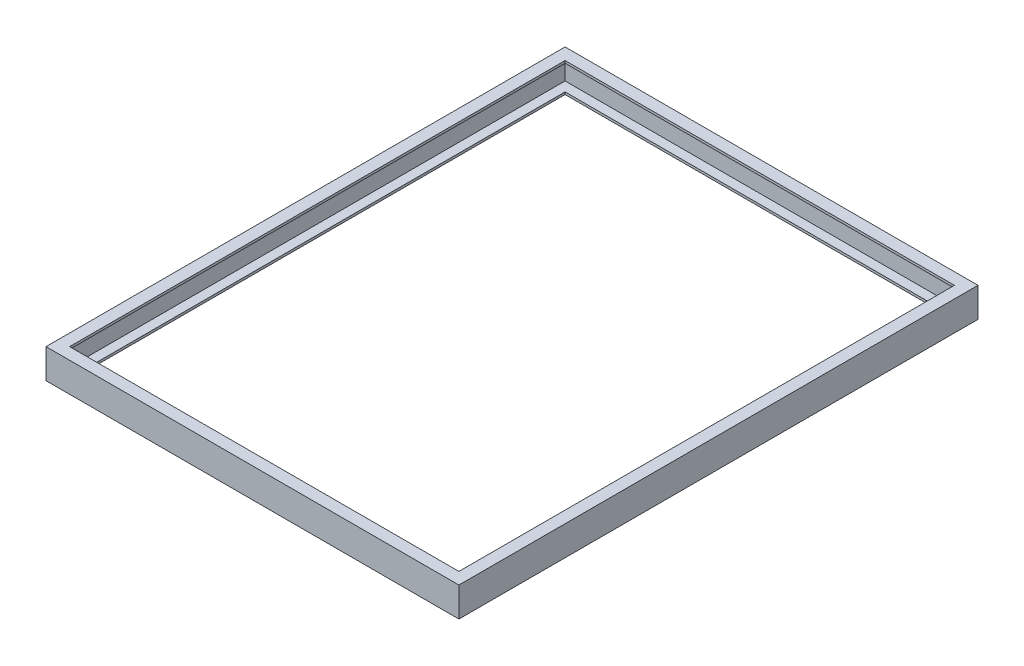
ISO-10303-21;
HEADER;
FILE_DESCRIPTION(('STEP AP214'),'2;1');
FILE_NAME('part.step','',(''),(''),'','','');
FILE_SCHEMA(('AUTOMOTIVE_DESIGN { 1 0 10303 214 1 1 1 1 }'));
ENDSEC;
DATA;
#1=APPLICATION_CONTEXT('core data for automotive mechanical design processes');
#2=APPLICATION_PROTOCOL_DEFINITION('international standard','automotive_design',2000,#1);
#3=PRODUCT_CONTEXT('',#1,'mechanical');
#4=PRODUCT('Part','Part','',(#3));
#5=PRODUCT_RELATED_PRODUCT_CATEGORY('part','',(#4));
#6=PRODUCT_DEFINITION_FORMATION('','',#4);
#7=PRODUCT_DEFINITION_CONTEXT('part definition',#1,'design');
#8=PRODUCT_DEFINITION('design','',#6,#7);
#9=PRODUCT_DEFINITION_SHAPE('','',#8);
#10=(LENGTH_UNIT() NAMED_UNIT(*) SI_UNIT(.MILLI.,.METRE.));
#11=(NAMED_UNIT(*) PLANE_ANGLE_UNIT() SI_UNIT($,.RADIAN.));
#12=(NAMED_UNIT(*) SI_UNIT($,.STERADIAN.) SOLID_ANGLE_UNIT());
#13=UNCERTAINTY_MEASURE_WITH_UNIT(LENGTH_MEASURE(1.E-05),#10,'distance_accuracy_value','');
#14=(GEOMETRIC_REPRESENTATION_CONTEXT(3) GLOBAL_UNCERTAINTY_ASSIGNED_CONTEXT((#13)) GLOBAL_UNIT_ASSIGNED_CONTEXT((#10,
#11,#12)) REPRESENTATION_CONTEXT('',''));
#15=CARTESIAN_POINT('',(0.,0.,0.));
#16=DIRECTION('',(0.,0.,1.));
#17=DIRECTION('',(1.,0.,0.));
#18=AXIS2_PLACEMENT_3D('',#15,#16,#17);
#19=CARTESIAN_POINT('',(-10.,25.,-10.));
#20=DIRECTION('',(0.,0.,-1.));
#21=DIRECTION('',(-1.,0.,0.));
#22=AXIS2_PLACEMENT_3D('',#19,#20,#21);
#23=PLANE('',#22);
#24=DIRECTION('',(0.,-1.,0.));
#25=VECTOR('',#24,1.);
#26=CARTESIAN_POINT('',(-340.,25.,-10.));
#27=LINE('',#26,#25);
#28=CARTESIAN_POINT('',(-340.,2.,-10.));
#29=VERTEX_POINT('',#28);
#30=CARTESIAN_POINT('',(-340.,0.,-10.));
#31=VERTEX_POINT('',#30);
#32=EDGE_CURVE('E213',#29,#31,#27,.T.);
#33=ORIENTED_EDGE('',*,*,#32,.F.);
#34=DIRECTION('',(1.,0.,0.));
#35=VECTOR('',#34,1.);
#36=CARTESIAN_POINT('',(-10.,2.,-10.));
#37=LINE('',#36,#35);
#38=CARTESIAN_POINT('',(-10.,2.,-10.));
#39=VERTEX_POINT('',#38);
#40=EDGE_CURVE('E47',#29,#39,#37,.T.);
#41=ORIENTED_EDGE('',*,*,#40,.T.);
#42=DIRECTION('',(0.,-1.,0.));
#43=VECTOR('',#42,1.);
#44=CARTESIAN_POINT('',(-10.,25.,-10.));
#45=LINE('',#44,#43);
#46=CARTESIAN_POINT('',(-10.,0.,-10.));
#47=VERTEX_POINT('',#46);
#48=EDGE_CURVE('E235',#39,#47,#45,.T.);
#49=ORIENTED_EDGE('',*,*,#48,.T.);
#50=DIRECTION('',(1.,0.,0.));
#51=VECTOR('',#50,1.);
#52=CARTESIAN_POINT('',(-10.,0.,-10.));
#53=LINE('',#52,#51);
#54=EDGE_CURVE('E180',#31,#47,#53,.T.);
#55=ORIENTED_EDGE('',*,*,#54,.F.);
#56=EDGE_LOOP('',(#33,#41,#49,#55));
#57=FACE_BOUND('',#56,.T.);
#58=ADVANCED_FACE('F32',(#57),#23,.T.);
#59=CARTESIAN_POINT('',(-10.,25.,-10.));
#60=DIRECTION('',(-1.,0.,0.));
#61=DIRECTION('',(0.,0.,1.));
#62=AXIS2_PLACEMENT_3D('',#59,#60,#61);
#63=PLANE('',#62);
#64=ORIENTED_EDGE('',*,*,#48,.F.);
#65=DIRECTION('',(0.,0.,-1.));
#66=VECTOR('',#65,1.);
#67=CARTESIAN_POINT('',(-10.,2.,-10.));
#68=LINE('',#67,#66);
#69=CARTESIAN_POINT('',(-10.,2.,-430.));
#70=VERTEX_POINT('',#69);
#71=EDGE_CURVE('E196',#39,#70,#68,.T.);
#72=ORIENTED_EDGE('',*,*,#71,.T.);
#73=DIRECTION('',(0.,-1.,0.));
#74=VECTOR('',#73,1.);
#75=CARTESIAN_POINT('',(-10.,25.,-430.));
#76=LINE('',#75,#74);
#77=CARTESIAN_POINT('',(-10.,0.,-430.));
#78=VERTEX_POINT('',#77);
#79=EDGE_CURVE('E231',#70,#78,#76,.T.);
#80=ORIENTED_EDGE('',*,*,#79,.T.);
#81=DIRECTION('',(0.,0.,-1.));
#82=VECTOR('',#81,1.);
#83=CARTESIAN_POINT('',(-10.,0.,-10.));
#84=LINE('',#83,#82);
#85=EDGE_CURVE('E216',#47,#78,#84,.T.);
#86=ORIENTED_EDGE('',*,*,#85,.F.);
#87=EDGE_LOOP('',(#64,#72,#80,#86));
#88=FACE_BOUND('',#87,.T.);
#89=ADVANCED_FACE('F293',(#88),#63,.T.);
#90=CARTESIAN_POINT('',(-10.,25.,-430.));
#91=DIRECTION('',(0.,0.,1.));
#92=DIRECTION('',(1.,0.,0.));
#93=AXIS2_PLACEMENT_3D('',#90,#91,#92);
#94=PLANE('',#93);
#95=ORIENTED_EDGE('',*,*,#79,.F.);
#96=DIRECTION('',(-1.,0.,0.));
#97=VECTOR('',#96,1.);
#98=CARTESIAN_POINT('',(-10.,2.,-430.));
#99=LINE('',#98,#97);
#100=CARTESIAN_POINT('',(-340.,2.,-430.));
#101=VERTEX_POINT('',#100);
#102=EDGE_CURVE('E198',#70,#101,#99,.T.);
#103=ORIENTED_EDGE('',*,*,#102,.T.);
#104=DIRECTION('',(0.,-1.,0.));
#105=VECTOR('',#104,1.);
#106=CARTESIAN_POINT('',(-340.,25.,-430.));
#107=LINE('',#106,#105);
#108=CARTESIAN_POINT('',(-340.,0.,-430.));
#109=VERTEX_POINT('',#108);
#110=EDGE_CURVE('E227',#101,#109,#107,.T.);
#111=ORIENTED_EDGE('',*,*,#110,.T.);
#112=DIRECTION('',(-1.,0.,0.));
#113=VECTOR('',#112,1.);
#114=CARTESIAN_POINT('',(-10.,0.,-430.));
#115=LINE('',#114,#113);
#116=EDGE_CURVE('E219',#78,#109,#115,.T.);
#117=ORIENTED_EDGE('',*,*,#116,.F.);
#118=EDGE_LOOP('',(#95,#103,#111,#117));
#119=FACE_BOUND('',#118,.T.);
#120=ADVANCED_FACE('F300',(#119),#94,.T.);
#121=CARTESIAN_POINT('',(-340.,25.,-10.));
#122=DIRECTION('',(1.,0.,0.));
#123=DIRECTION('',(0.,0.,-1.));
#124=AXIS2_PLACEMENT_3D('',#121,#122,#123);
#125=PLANE('',#124);
#126=ORIENTED_EDGE('',*,*,#110,.F.);
#127=DIRECTION('',(0.,0.,1.));
#128=VECTOR('',#127,1.);
#129=CARTESIAN_POINT('',(-340.,2.,-10.));
#130=LINE('',#129,#128);
#131=EDGE_CURVE('E194',#101,#29,#130,.T.);
#132=ORIENTED_EDGE('',*,*,#131,.T.);
#133=ORIENTED_EDGE('',*,*,#32,.T.);
#134=DIRECTION('',(0.,0.,1.));
#135=VECTOR('',#134,1.);
#136=CARTESIAN_POINT('',(-340.,0.,-10.));
#137=LINE('',#136,#135);
#138=EDGE_CURVE('E206',#109,#31,#137,.T.);
#139=ORIENTED_EDGE('',*,*,#138,.F.);
#140=EDGE_LOOP('',(#126,#132,#133,#139));
#141=FACE_BOUND('',#140,.T.);
#142=ADVANCED_FACE('F333',(#141),#125,.T.);
#143=CARTESIAN_POINT('',(0.,25.,0.));
#144=DIRECTION('',(0.,1.,0.));
#145=DIRECTION('',(0.,0.,1.));
#146=AXIS2_PLACEMENT_3D('',#143,#144,#145);
#147=PLANE('',#146);
#148=DIRECTION('',(0.,0.,-1.));
#149=VECTOR('',#148,1.);
#150=CARTESIAN_POINT('',(0.,25.,0.));
#151=LINE('',#150,#149);
#152=CARTESIAN_POINT('',(0.,25.,0.));
#153=VERTEX_POINT('',#152);
#154=CARTESIAN_POINT('',(0.,25.,-440.));
#155=VERTEX_POINT('',#154);
#156=EDGE_CURVE('E240',#153,#155,#151,.T.);
#157=ORIENTED_EDGE('',*,*,#156,.T.);
#158=DIRECTION('',(-1.,0.,0.));
#159=VECTOR('',#158,1.);
#160=CARTESIAN_POINT('',(0.,25.,-440.));
#161=LINE('',#160,#159);
#162=CARTESIAN_POINT('',(-350.,25.,-440.));
#163=VERTEX_POINT('',#162);
#164=EDGE_CURVE('E243',#155,#163,#161,.T.);
#165=ORIENTED_EDGE('',*,*,#164,.T.);
#166=DIRECTION('',(0.,0.,1.));
#167=VECTOR('',#166,1.);
#168=CARTESIAN_POINT('',(-350.,25.,0.));
#169=LINE('',#168,#167);
#170=CARTESIAN_POINT('',(-350.,25.,0.));
#171=VERTEX_POINT('',#170);
#172=EDGE_CURVE('E246',#163,#171,#169,.T.);
#173=ORIENTED_EDGE('',*,*,#172,.T.);
#174=DIRECTION('',(1.,0.,0.));
#175=VECTOR('',#174,1.);
#176=CARTESIAN_POINT('',(0.,25.,0.));
#177=LINE('',#176,#175);
#178=EDGE_CURVE('E248',#171,#153,#177,.T.);
#179=ORIENTED_EDGE('',*,*,#178,.T.);
#180=EDGE_LOOP('',(#157,#165,#173,#179));
#181=FACE_BOUND('',#180,.T.);
#182=DIRECTION('',(0.,0.,-1.));
#183=VECTOR('',#182,1.);
#184=CARTESIAN_POINT('',(-10.,25.,-10.));
#185=LINE('',#184,#183);
#186=CARTESIAN_POINT('',(-10.,25.,-10.));
#187=VERTEX_POINT('',#186);
#188=CARTESIAN_POINT('',(-10.,25.,-430.));
#189=VERTEX_POINT('',#188);
#190=EDGE_CURVE('E205',#187,#189,#185,.T.);
#191=ORIENTED_EDGE('',*,*,#190,.F.);
#192=DIRECTION('',(1.,0.,0.));
#193=VECTOR('',#192,1.);
#194=CARTESIAN_POINT('',(-10.,25.,-10.));
#195=LINE('',#194,#193);
#196=CARTESIAN_POINT('',(-340.,25.,-10.));
#197=VERTEX_POINT('',#196);
#198=EDGE_CURVE('E203',#197,#187,#195,.T.);
#199=ORIENTED_EDGE('',*,*,#198,.F.);
#200=DIRECTION('',(0.,0.,1.));
#201=VECTOR('',#200,1.);
#202=CARTESIAN_POINT('',(-340.,25.,-10.));
#203=LINE('',#202,#201);
#204=CARTESIAN_POINT('',(-340.,25.,-430.));
#205=VERTEX_POINT('',#204);
#206=EDGE_CURVE('E211',#205,#197,#203,.T.);
#207=ORIENTED_EDGE('',*,*,#206,.F.);
#208=DIRECTION('',(-1.,0.,0.));
#209=VECTOR('',#208,1.);
#210=CARTESIAN_POINT('',(-10.,25.,-430.));
#211=LINE('',#210,#209);
#212=EDGE_CURVE('E208',#189,#205,#211,.T.);
#213=ORIENTED_EDGE('',*,*,#212,.F.);
#214=EDGE_LOOP('',(#191,#199,#207,#213));
#215=FACE_BOUND('',#214,.T.);
#216=ADVANCED_FACE('F283',(#181,#215),#147,.T.);
#217=CARTESIAN_POINT('',(0.,0.,0.));
#218=DIRECTION('',(0.,1.,0.));
#219=DIRECTION('',(0.,0.,1.));
#220=AXIS2_PLACEMENT_3D('',#217,#218,#219);
#221=PLANE('',#220);
#222=DIRECTION('',(0.,0.,-1.));
#223=VECTOR('',#222,1.);
#224=CARTESIAN_POINT('',(0.,0.,0.));
#225=LINE('',#224,#223);
#226=CARTESIAN_POINT('',(0.,0.,0.));
#227=VERTEX_POINT('',#226);
#228=CARTESIAN_POINT('',(0.,0.,-440.));
#229=VERTEX_POINT('',#228);
#230=EDGE_CURVE('E239',#227,#229,#225,.T.);
#231=ORIENTED_EDGE('',*,*,#230,.F.);
#232=DIRECTION('',(1.,0.,0.));
#233=VECTOR('',#232,1.);
#234=CARTESIAN_POINT('',(0.,0.,0.));
#235=LINE('',#234,#233);
#236=CARTESIAN_POINT('',(-350.,0.,0.));
#237=VERTEX_POINT('',#236);
#238=EDGE_CURVE('E244',#237,#227,#235,.T.);
#239=ORIENTED_EDGE('',*,*,#238,.F.);
#240=DIRECTION('',(0.,0.,1.));
#241=VECTOR('',#240,1.);
#242=CARTESIAN_POINT('',(-350.,0.,0.));
#243=LINE('',#242,#241);
#244=CARTESIAN_POINT('',(-350.,0.,-440.));
#245=VERTEX_POINT('',#244);
#246=EDGE_CURVE('E255',#245,#237,#243,.T.);
#247=ORIENTED_EDGE('',*,*,#246,.F.);
#248=DIRECTION('',(-1.,0.,0.));
#249=VECTOR('',#248,1.);
#250=CARTESIAN_POINT('',(0.,0.,-440.));
#251=LINE('',#250,#249);
#252=EDGE_CURVE('E253',#229,#245,#251,.T.);
#253=ORIENTED_EDGE('',*,*,#252,.F.);
#254=EDGE_LOOP('',(#231,#239,#247,#253));
#255=FACE_BOUND('',#254,.T.);
#256=ORIENTED_EDGE('',*,*,#54,.T.);
#257=ORIENTED_EDGE('',*,*,#85,.T.);
#258=ORIENTED_EDGE('',*,*,#116,.T.);
#259=ORIENTED_EDGE('',*,*,#138,.T.);
#260=EDGE_LOOP('',(#256,#257,#258,#259));
#261=FACE_BOUND('',#260,.T.);
#262=ADVANCED_FACE('F273',(#255,#261),#221,.F.);
#263=CARTESIAN_POINT('',(0.,25.,0.));
#264=DIRECTION('',(-1.,0.,0.));
#265=DIRECTION('',(0.,0.,1.));
#266=AXIS2_PLACEMENT_3D('',#263,#264,#265);
#267=PLANE('',#266);
#268=ORIENTED_EDGE('',*,*,#230,.T.);
#269=DIRECTION('',(0.,-1.,0.));
#270=VECTOR('',#269,1.);
#271=CARTESIAN_POINT('',(0.,25.,-440.));
#272=LINE('',#271,#270);
#273=EDGE_CURVE('E11',#155,#229,#272,.T.);
#274=ORIENTED_EDGE('',*,*,#273,.F.);
#275=ORIENTED_EDGE('',*,*,#156,.F.);
#276=DIRECTION('',(0.,-1.,0.));
#277=VECTOR('',#276,1.);
#278=CARTESIAN_POINT('',(0.,25.,0.));
#279=LINE('',#278,#277);
#280=EDGE_CURVE('E250',#153,#227,#279,.T.);
#281=ORIENTED_EDGE('',*,*,#280,.T.);
#282=EDGE_LOOP('',(#268,#274,#275,#281));
#283=FACE_BOUND('',#282,.T.);
#284=ADVANCED_FACE('F34',(#283),#267,.F.);
#285=CARTESIAN_POINT('',(0.,25.,-440.));
#286=DIRECTION('',(0.,0.,1.));
#287=DIRECTION('',(1.,0.,0.));
#288=AXIS2_PLACEMENT_3D('',#285,#286,#287);
#289=PLANE('',#288);
#290=ORIENTED_EDGE('',*,*,#252,.T.);
#291=DIRECTION('',(0.,-1.,0.));
#292=VECTOR('',#291,1.);
#293=CARTESIAN_POINT('',(-350.,25.,-440.));
#294=LINE('',#293,#292);
#295=EDGE_CURVE('E40',#163,#245,#294,.T.);
#296=ORIENTED_EDGE('',*,*,#295,.F.);
#297=ORIENTED_EDGE('',*,*,#164,.F.);
#298=ORIENTED_EDGE('',*,*,#273,.T.);
#299=EDGE_LOOP('',(#290,#296,#297,#298));
#300=FACE_BOUND('',#299,.T.);
#301=ADVANCED_FACE('F285',(#300),#289,.F.);
#302=CARTESIAN_POINT('',(-350.,25.,0.));
#303=DIRECTION('',(1.,0.,0.));
#304=DIRECTION('',(0.,0.,-1.));
#305=AXIS2_PLACEMENT_3D('',#302,#303,#304);
#306=PLANE('',#305);
#307=ORIENTED_EDGE('',*,*,#246,.T.);
#308=DIRECTION('',(0.,-1.,0.));
#309=VECTOR('',#308,1.);
#310=CARTESIAN_POINT('',(-350.,25.,0.));
#311=LINE('',#310,#309);
#312=EDGE_CURVE('E260',#171,#237,#311,.T.);
#313=ORIENTED_EDGE('',*,*,#312,.F.);
#314=ORIENTED_EDGE('',*,*,#172,.F.);
#315=ORIENTED_EDGE('',*,*,#295,.T.);
#316=EDGE_LOOP('',(#307,#313,#314,#315));
#317=FACE_BOUND('',#316,.T.);
#318=ADVANCED_FACE('F267',(#317),#306,.F.);
#319=CARTESIAN_POINT('',(0.,25.,0.));
#320=DIRECTION('',(0.,0.,-1.));
#321=DIRECTION('',(-1.,0.,0.));
#322=AXIS2_PLACEMENT_3D('',#319,#320,#321);
#323=PLANE('',#322);
#324=ORIENTED_EDGE('',*,*,#238,.T.);
#325=ORIENTED_EDGE('',*,*,#280,.F.);
#326=ORIENTED_EDGE('',*,*,#178,.F.);
#327=ORIENTED_EDGE('',*,*,#312,.T.);
#328=EDGE_LOOP('',(#324,#325,#326,#327));
#329=FACE_BOUND('',#328,.T.);
#330=ADVANCED_FACE('F277',(#329),#323,.F.);
#331=DIRECTION('',(1.,0.,0.));
#332=VECTOR('',#331,1.);
#333=CARTESIAN_POINT('',(-10.,23.,-10.));
#334=LINE('',#333,#332);
#335=CARTESIAN_POINT('',(-340.,23.,-10.));
#336=VERTEX_POINT('',#335);
#337=CARTESIAN_POINT('',(-10.,23.,-10.));
#338=VERTEX_POINT('',#337);
#339=EDGE_CURVE('E190',#336,#338,#334,.T.);
#340=ORIENTED_EDGE('',*,*,#339,.F.);
#341=EDGE_CURVE('E224',#197,#336,#27,.T.);
#342=ORIENTED_EDGE('',*,*,#341,.F.);
#343=ORIENTED_EDGE('',*,*,#198,.T.);
#344=EDGE_CURVE('E236',#187,#338,#45,.T.);
#345=ORIENTED_EDGE('',*,*,#344,.T.);
#346=EDGE_LOOP('',(#340,#342,#343,#345));
#347=FACE_BOUND('',#346,.T.);
#348=ADVANCED_FACE('F296',(#347),#23,.T.);
#349=DIRECTION('',(0.,0.,-1.));
#350=VECTOR('',#349,1.);
#351=CARTESIAN_POINT('',(-10.,23.,-10.));
#352=LINE('',#351,#350);
#353=CARTESIAN_POINT('',(-10.,23.,-430.));
#354=VERTEX_POINT('',#353);
#355=EDGE_CURVE('E188',#338,#354,#352,.T.);
#356=ORIENTED_EDGE('',*,*,#355,.F.);
#357=ORIENTED_EDGE('',*,*,#344,.F.);
#358=ORIENTED_EDGE('',*,*,#190,.T.);
#359=EDGE_CURVE('E232',#189,#354,#76,.T.);
#360=ORIENTED_EDGE('',*,*,#359,.T.);
#361=EDGE_LOOP('',(#356,#357,#358,#360));
#362=FACE_BOUND('',#361,.T.);
#363=ADVANCED_FACE('F303',(#362),#63,.T.);
#364=DIRECTION('',(-1.,0.,0.));
#365=VECTOR('',#364,1.);
#366=CARTESIAN_POINT('',(-10.,23.,-430.));
#367=LINE('',#366,#365);
#368=CARTESIAN_POINT('',(-340.,23.,-430.));
#369=VERTEX_POINT('',#368);
#370=EDGE_CURVE('E55',#354,#369,#367,.T.);
#371=ORIENTED_EDGE('',*,*,#370,.F.);
#372=ORIENTED_EDGE('',*,*,#359,.F.);
#373=ORIENTED_EDGE('',*,*,#212,.T.);
#374=EDGE_CURVE('E228',#205,#369,#107,.T.);
#375=ORIENTED_EDGE('',*,*,#374,.T.);
#376=EDGE_LOOP('',(#371,#372,#373,#375));
#377=FACE_BOUND('',#376,.T.);
#378=ADVANCED_FACE('F312',(#377),#94,.T.);
#379=DIRECTION('',(0.,0.,1.));
#380=VECTOR('',#379,1.);
#381=CARTESIAN_POINT('',(-340.,23.,-10.));
#382=LINE('',#381,#380);
#383=EDGE_CURVE('E178',#369,#336,#382,.T.);
#384=ORIENTED_EDGE('',*,*,#383,.F.);
#385=ORIENTED_EDGE('',*,*,#374,.F.);
#386=ORIENTED_EDGE('',*,*,#206,.T.);
#387=ORIENTED_EDGE('',*,*,#341,.T.);
#388=EDGE_LOOP('',(#384,#385,#386,#387));
#389=FACE_BOUND('',#388,.T.);
#390=ADVANCED_FACE('F321',(#389),#125,.T.);
#391=CARTESIAN_POINT('',(0.,23.,0.));
#392=DIRECTION('',(0.,1.,0.));
#393=DIRECTION('',(0.,0.,1.));
#394=AXIS2_PLACEMENT_3D('',#391,#392,#393);
#395=PLANE('',#394);
#396=DIRECTION('',(0.,0.,-1.));
#397=VECTOR('',#396,1.);
#398=CARTESIAN_POINT('',(-2.,23.,0.));
#399=LINE('',#398,#397);
#400=CARTESIAN_POINT('',(-2.,23.,-2.));
#401=VERTEX_POINT('',#400);
#402=CARTESIAN_POINT('',(-2.,23.,-438.));
#403=VERTEX_POINT('',#402);
#404=EDGE_CURVE('E157',#401,#403,#399,.T.);
#405=ORIENTED_EDGE('',*,*,#404,.F.);
#406=DIRECTION('',(1.,0.,0.));
#407=VECTOR('',#406,1.);
#408=CARTESIAN_POINT('',(0.,23.,-2.));
#409=LINE('',#408,#407);
#410=CARTESIAN_POINT('',(-348.,23.,-2.));
#411=VERTEX_POINT('',#410);
#412=EDGE_CURVE('E168',#411,#401,#409,.T.);
#413=ORIENTED_EDGE('',*,*,#412,.F.);
#414=DIRECTION('',(0.,0.,1.));
#415=VECTOR('',#414,1.);
#416=CARTESIAN_POINT('',(-348.,23.,0.));
#417=LINE('',#416,#415);
#418=CARTESIAN_POINT('',(-348.,23.,-438.));
#419=VERTEX_POINT('',#418);
#420=EDGE_CURVE('E156',#419,#411,#417,.T.);
#421=ORIENTED_EDGE('',*,*,#420,.F.);
#422=DIRECTION('',(-1.,0.,0.));
#423=VECTOR('',#422,1.);
#424=CARTESIAN_POINT('',(0.,23.,-438.));
#425=LINE('',#424,#423);
#426=EDGE_CURVE('E145',#403,#419,#425,.T.);
#427=ORIENTED_EDGE('',*,*,#426,.F.);
#428=EDGE_LOOP('',(#405,#413,#421,#427));
#429=FACE_BOUND('',#428,.T.);
#430=ORIENTED_EDGE('',*,*,#355,.T.);
#431=ORIENTED_EDGE('',*,*,#370,.T.);
#432=ORIENTED_EDGE('',*,*,#383,.T.);
#433=ORIENTED_EDGE('',*,*,#339,.T.);
#434=EDGE_LOOP('',(#430,#431,#432,#433));
#435=FACE_BOUND('',#434,.T.);
#436=ADVANCED_FACE('F167',(#429,#435),#395,.F.);
#437=CARTESIAN_POINT('',(0.,2.,0.));
#438=DIRECTION('',(0.,1.,0.));
#439=DIRECTION('',(0.,0.,1.));
#440=AXIS2_PLACEMENT_3D('',#437,#438,#439);
#441=PLANE('',#440);
#442=DIRECTION('',(0.,0.,-1.));
#443=VECTOR('',#442,1.);
#444=CARTESIAN_POINT('',(-2.,2.,0.));
#445=LINE('',#444,#443);
#446=CARTESIAN_POINT('',(-2.,2.,-2.));
#447=VERTEX_POINT('',#446);
#448=CARTESIAN_POINT('',(-2.,2.,-438.));
#449=VERTEX_POINT('',#448);
#450=EDGE_CURVE('E174',#447,#449,#445,.T.);
#451=ORIENTED_EDGE('',*,*,#450,.T.);
#452=DIRECTION('',(-1.,0.,0.));
#453=VECTOR('',#452,1.);
#454=CARTESIAN_POINT('',(0.,2.,-438.));
#455=LINE('',#454,#453);
#456=CARTESIAN_POINT('',(-348.,2.,-438.));
#457=VERTEX_POINT('',#456);
#458=EDGE_CURVE('E177',#449,#457,#455,.T.);
#459=ORIENTED_EDGE('',*,*,#458,.T.);
#460=DIRECTION('',(0.,0.,1.));
#461=VECTOR('',#460,1.);
#462=CARTESIAN_POINT('',(-348.,2.,0.));
#463=LINE('',#462,#461);
#464=CARTESIAN_POINT('',(-348.,2.,-2.));
#465=VERTEX_POINT('',#464);
#466=EDGE_CURVE('E163',#457,#465,#463,.T.);
#467=ORIENTED_EDGE('',*,*,#466,.T.);
#468=DIRECTION('',(1.,0.,0.));
#469=VECTOR('',#468,1.);
#470=CARTESIAN_POINT('',(0.,2.,-2.));
#471=LINE('',#470,#469);
#472=EDGE_CURVE('E183',#465,#447,#471,.T.);
#473=ORIENTED_EDGE('',*,*,#472,.T.);
#474=EDGE_LOOP('',(#451,#459,#467,#473));
#475=FACE_BOUND('',#474,.T.);
#476=ORIENTED_EDGE('',*,*,#40,.F.);
#477=ORIENTED_EDGE('',*,*,#131,.F.);
#478=ORIENTED_EDGE('',*,*,#102,.F.);
#479=ORIENTED_EDGE('',*,*,#71,.F.);
#480=EDGE_LOOP('',(#476,#477,#478,#479));
#481=FACE_BOUND('',#480,.T.);
#482=ADVANCED_FACE('F345',(#475,#481),#441,.T.);
#483=CARTESIAN_POINT('',(-2.,25.,0.));
#484=DIRECTION('',(-1.,0.,0.));
#485=DIRECTION('',(0.,0.,1.));
#486=AXIS2_PLACEMENT_3D('',#483,#484,#485);
#487=PLANE('',#486);
#488=ORIENTED_EDGE('',*,*,#450,.F.);
#489=DIRECTION('',(0.,-1.,0.));
#490=VECTOR('',#489,1.);
#491=CARTESIAN_POINT('',(-2.,25.,-2.));
#492=LINE('',#491,#490);
#493=EDGE_CURVE('E170',#401,#447,#492,.T.);
#494=ORIENTED_EDGE('',*,*,#493,.F.);
#495=ORIENTED_EDGE('',*,*,#404,.T.);
#496=DIRECTION('',(0.,-1.,0.));
#497=VECTOR('',#496,1.);
#498=CARTESIAN_POINT('',(-2.,25.,-438.));
#499=LINE('',#498,#497);
#500=EDGE_CURVE('E151',#403,#449,#499,.T.);
#501=ORIENTED_EDGE('',*,*,#500,.T.);
#502=EDGE_LOOP('',(#488,#494,#495,#501));
#503=FACE_BOUND('',#502,.T.);
#504=ADVANCED_FACE('F401',(#503),#487,.T.);
#505=CARTESIAN_POINT('',(0.,25.,-438.));
#506=DIRECTION('',(0.,0.,1.));
#507=DIRECTION('',(1.,0.,0.));
#508=AXIS2_PLACEMENT_3D('',#505,#506,#507);
#509=PLANE('',#508);
#510=ORIENTED_EDGE('',*,*,#458,.F.);
#511=ORIENTED_EDGE('',*,*,#500,.F.);
#512=ORIENTED_EDGE('',*,*,#426,.T.);
#513=DIRECTION('',(0.,-1.,0.));
#514=VECTOR('',#513,1.);
#515=CARTESIAN_POINT('',(-348.,25.,-438.));
#516=LINE('',#515,#514);
#517=EDGE_CURVE('E148',#419,#457,#516,.T.);
#518=ORIENTED_EDGE('',*,*,#517,.T.);
#519=EDGE_LOOP('',(#510,#511,#512,#518));
#520=FACE_BOUND('',#519,.T.);
#521=ADVANCED_FACE('F147',(#520),#509,.T.);
#522=CARTESIAN_POINT('',(-348.,25.,0.));
#523=DIRECTION('',(1.,0.,0.));
#524=DIRECTION('',(0.,0.,-1.));
#525=AXIS2_PLACEMENT_3D('',#522,#523,#524);
#526=PLANE('',#525);
#527=ORIENTED_EDGE('',*,*,#466,.F.);
#528=ORIENTED_EDGE('',*,*,#517,.F.);
#529=ORIENTED_EDGE('',*,*,#420,.T.);
#530=DIRECTION('',(0.,-1.,0.));
#531=VECTOR('',#530,1.);
#532=CARTESIAN_POINT('',(-348.,25.,-2.));
#533=LINE('',#532,#531);
#534=EDGE_CURVE('E164',#411,#465,#533,.T.);
#535=ORIENTED_EDGE('',*,*,#534,.T.);
#536=EDGE_LOOP('',(#527,#528,#529,#535));
#537=FACE_BOUND('',#536,.T.);
#538=ADVANCED_FACE('F160',(#537),#526,.T.);
#539=CARTESIAN_POINT('',(0.,25.,-2.));
#540=DIRECTION('',(0.,0.,-1.));
#541=DIRECTION('',(-1.,0.,0.));
#542=AXIS2_PLACEMENT_3D('',#539,#540,#541);
#543=PLANE('',#542);
#544=ORIENTED_EDGE('',*,*,#472,.F.);
#545=ORIENTED_EDGE('',*,*,#534,.F.);
#546=ORIENTED_EDGE('',*,*,#412,.T.);
#547=ORIENTED_EDGE('',*,*,#493,.T.);
#548=EDGE_LOOP('',(#544,#545,#546,#547));
#549=FACE_BOUND('',#548,.T.);
#550=ADVANCED_FACE('F428',(#549),#543,.T.);
#551=CLOSED_SHELL('',(#58,#89,#120,#142,#216,#262,#284,#301,#318,#330,#348,#363,#378,#390,#436,
#482,#504,#521,#538,#550));
#552=MANIFOLD_SOLID_BREP('B2',#551);
#553=ADVANCED_BREP_SHAPE_REPRESENTATION('',(#18,#552),#14);
#554=SHAPE_DEFINITION_REPRESENTATION(#9,#553);
ENDSEC;
END-ISO-10303-21;
